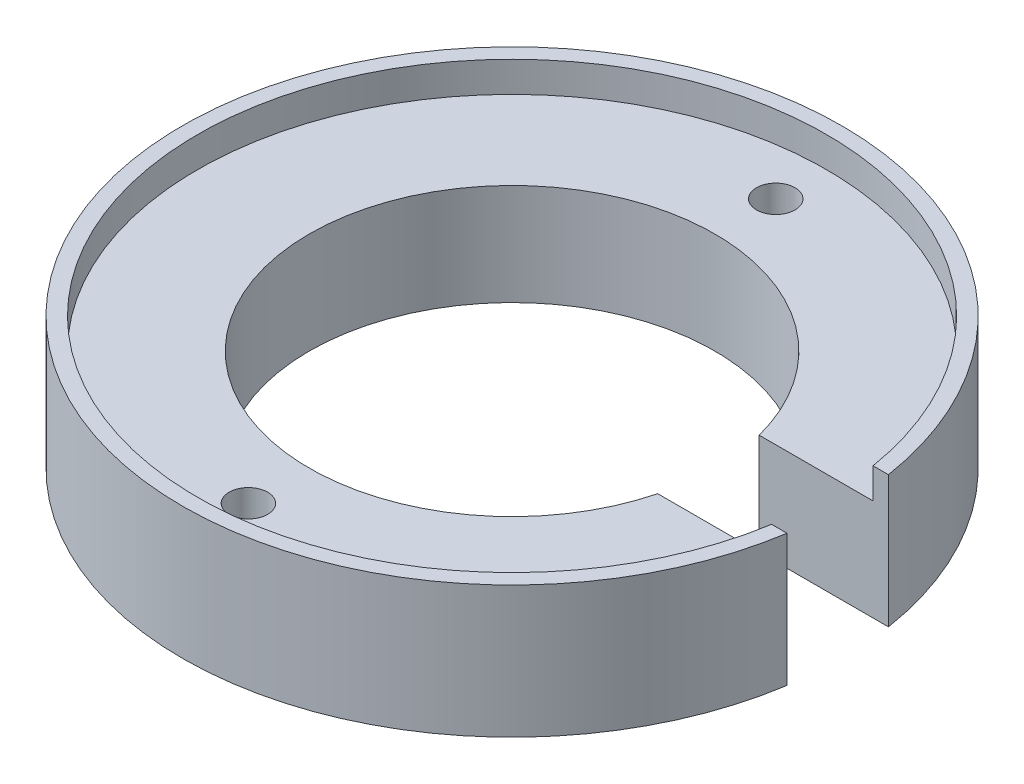
ISO-10303-21;
HEADER;
FILE_DESCRIPTION(('STEP AP214'),'2;1');
FILE_NAME('part.step','',(''),(''),'','','');
FILE_SCHEMA(('AUTOMOTIVE_DESIGN { 1 0 10303 214 1 1 1 1 }'));
ENDSEC;
DATA;
#1=APPLICATION_CONTEXT('core data for automotive mechanical design processes');
#2=APPLICATION_PROTOCOL_DEFINITION('international standard','automotive_design',2000,#1);
#3=PRODUCT_CONTEXT('',#1,'mechanical');
#4=PRODUCT('Part','Part','',(#3));
#5=PRODUCT_RELATED_PRODUCT_CATEGORY('part','',(#4));
#6=PRODUCT_DEFINITION_FORMATION('','',#4);
#7=PRODUCT_DEFINITION_CONTEXT('part definition',#1,'design');
#8=PRODUCT_DEFINITION('design','',#6,#7);
#9=PRODUCT_DEFINITION_SHAPE('','',#8);
#10=(LENGTH_UNIT() NAMED_UNIT(*) SI_UNIT(.MILLI.,.METRE.));
#11=(NAMED_UNIT(*) PLANE_ANGLE_UNIT() SI_UNIT($,.RADIAN.));
#12=(NAMED_UNIT(*) SI_UNIT($,.STERADIAN.) SOLID_ANGLE_UNIT());
#13=UNCERTAINTY_MEASURE_WITH_UNIT(LENGTH_MEASURE(1.E-05),#10,'distance_accuracy_value','');
#14=(GEOMETRIC_REPRESENTATION_CONTEXT(3) GLOBAL_UNCERTAINTY_ASSIGNED_CONTEXT((#13)) GLOBAL_UNIT_ASSIGNED_CONTEXT((#10,
#11,#12)) REPRESENTATION_CONTEXT('',''));
#15=CARTESIAN_POINT('',(0.,0.,0.));
#16=DIRECTION('',(0.,0.,1.));
#17=DIRECTION('',(1.,0.,0.));
#18=AXIS2_PLACEMENT_3D('',#15,#16,#17);
#19=CARTESIAN_POINT('',(0.,10.,0.));
#20=DIRECTION('',(0.,-1.,0.));
#21=DIRECTION('',(0.,0.,-1.));
#22=AXIS2_PLACEMENT_3D('',#19,#20,#21);
#23=CYLINDRICAL_SURFACE('',#22,32.5);
#24=DIRECTION('',(0.,-1.,0.));
#25=VECTOR('',#24,1.);
#26=CARTESIAN_POINT('',(32.1130814466628,10.,-5.));
#27=LINE('',#26,#25);
#28=CARTESIAN_POINT('',(32.1130814466628,0.,-5.));
#29=VERTEX_POINT('',#28);
#30=CARTESIAN_POINT('',(32.1130814466628,13.,-5.));
#31=VERTEX_POINT('',#30);
#32=EDGE_CURVE('E111',#29,#31,#27,.F.);
#33=ORIENTED_EDGE('',*,*,#32,.F.);
#34=CARTESIAN_POINT('',(0.,0.,0.));
#35=DIRECTION('',(0.,1.,0.));
#36=DIRECTION('',(0.,0.,1.));
#37=AXIS2_PLACEMENT_3D('',#34,#35,#36);
#38=CIRCLE('',#37,32.5);
#39=CARTESIAN_POINT('',(32.1130814466628,0.,5.));
#40=VERTEX_POINT('',#39);
#41=EDGE_CURVE('E102',#29,#40,#38,.T.);
#42=ORIENTED_EDGE('',*,*,#41,.T.);
#43=DIRECTION('',(0.,-1.,0.));
#44=VECTOR('',#43,1.);
#45=CARTESIAN_POINT('',(32.1130814466628,10.,5.));
#46=LINE('',#45,#44);
#47=CARTESIAN_POINT('',(32.1130814466628,13.,5.));
#48=VERTEX_POINT('',#47);
#49=EDGE_CURVE('E114',#48,#40,#46,.T.);
#50=ORIENTED_EDGE('',*,*,#49,.F.);
#51=CARTESIAN_POINT('',(0.,13.,0.));
#52=DIRECTION('',(0.,1.,0.));
#53=DIRECTION('',(0.,0.,1.));
#54=AXIS2_PLACEMENT_3D('',#51,#52,#53);
#55=CIRCLE('',#54,32.5);
#56=EDGE_CURVE('E105',#31,#48,#55,.T.);
#57=ORIENTED_EDGE('',*,*,#56,.F.);
#58=EDGE_LOOP('',(#33,#42,#50,#57));
#59=FACE_BOUND('',#58,.T.);
#60=ADVANCED_FACE('F32',(#59),#23,.T.);
#61=CARTESIAN_POINT('',(0.,0.,0.));
#62=DIRECTION('',(0.,1.,0.));
#63=DIRECTION('',(0.,0.,1.));
#64=AXIS2_PLACEMENT_3D('',#61,#62,#63);
#65=PLANE('',#64);
#66=CARTESIAN_POINT('',(0.,0.,-26.));
#67=DIRECTION('',(0.,1.,0.));
#68=DIRECTION('',(0.,0.,1.));
#69=AXIS2_PLACEMENT_3D('',#66,#67,#68);
#70=CIRCLE('',#69,1.9);
#71=CARTESIAN_POINT('',(0.,0.,-24.1));
#72=VERTEX_POINT('',#71);
#73=EDGE_CURVE('E134',#72,#72,#70,.T.);
#74=ORIENTED_EDGE('',*,*,#73,.T.);
#75=EDGE_LOOP('',(#74));
#76=FACE_BOUND('',#75,.T.);
#77=CARTESIAN_POINT('',(0.,0.,26.));
#78=DIRECTION('',(0.,1.,0.));
#79=DIRECTION('',(0.,0.,1.));
#80=AXIS2_PLACEMENT_3D('',#77,#78,#79);
#81=CIRCLE('',#80,1.9);
#82=CARTESIAN_POINT('',(0.,0.,27.9));
#83=VERTEX_POINT('',#82);
#84=EDGE_CURVE('E128',#83,#83,#81,.T.);
#85=ORIENTED_EDGE('',*,*,#84,.T.);
#86=EDGE_LOOP('',(#85));
#87=FACE_BOUND('',#86,.T.);
#88=DIRECTION('',(-1.,0.,0.));
#89=VECTOR('',#88,1.);
#90=CARTESIAN_POINT('',(0.,0.,-5.));
#91=LINE('',#90,#89);
#92=CARTESIAN_POINT('',(19.3649167310371,0.,-5.));
#93=VERTEX_POINT('',#92);
#94=EDGE_CURVE('E126',#29,#93,#91,.T.);
#95=ORIENTED_EDGE('',*,*,#94,.T.);
#96=CARTESIAN_POINT('',(0.,0.,0.));
#97=DIRECTION('',(0.,1.,0.));
#98=DIRECTION('',(0.,0.,1.));
#99=AXIS2_PLACEMENT_3D('',#96,#97,#98);
#100=CIRCLE('',#99,20.);
#101=CARTESIAN_POINT('',(19.3649167310371,0.,5.));
#102=VERTEX_POINT('',#101);
#103=EDGE_CURVE('E84',#93,#102,#100,.T.);
#104=ORIENTED_EDGE('',*,*,#103,.T.);
#105=DIRECTION('',(1.,0.,0.));
#106=VECTOR('',#105,1.);
#107=CARTESIAN_POINT('',(0.,0.,5.));
#108=LINE('',#107,#106);
#109=EDGE_CURVE('E124',#102,#40,#108,.T.);
#110=ORIENTED_EDGE('',*,*,#109,.T.);
#111=ORIENTED_EDGE('',*,*,#41,.F.);
#112=EDGE_LOOP('',(#95,#104,#110,#111));
#113=FACE_BOUND('',#112,.T.);
#114=ADVANCED_FACE('F141',(#76,#87,#113),#65,.F.);
#115=CARTESIAN_POINT('',(0.,13.,0.));
#116=DIRECTION('',(0.,1.,0.));
#117=DIRECTION('',(0.,0.,1.));
#118=AXIS2_PLACEMENT_3D('',#115,#116,#117);
#119=PLANE('',#118);
#120=CARTESIAN_POINT('',(0.,13.,0.));
#121=DIRECTION('',(0.,1.,0.));
#122=DIRECTION('',(0.,0.,1.));
#123=AXIS2_PLACEMENT_3D('',#120,#121,#122);
#124=CIRCLE('',#123,31.);
#125=CARTESIAN_POINT('',(30.5941170815567,13.,-5.));
#126=VERTEX_POINT('',#125);
#127=CARTESIAN_POINT('',(30.5941170815567,13.,5.));
#128=VERTEX_POINT('',#127);
#129=EDGE_CURVE('E108',#126,#128,#124,.T.);
#130=ORIENTED_EDGE('',*,*,#129,.F.);
#131=DIRECTION('',(-1.,0.,0.));
#132=VECTOR('',#131,1.);
#133=CARTESIAN_POINT('',(0.,13.,-5.));
#134=LINE('',#133,#132);
#135=EDGE_CURVE('E122',#31,#126,#134,.T.);
#136=ORIENTED_EDGE('',*,*,#135,.F.);
#137=ORIENTED_EDGE('',*,*,#56,.T.);
#138=DIRECTION('',(1.,0.,0.));
#139=VECTOR('',#138,1.);
#140=CARTESIAN_POINT('',(0.,13.,5.));
#141=LINE('',#140,#139);
#142=EDGE_CURVE('E120',#128,#48,#141,.T.);
#143=ORIENTED_EDGE('',*,*,#142,.F.);
#144=EDGE_LOOP('',(#130,#136,#137,#143));
#145=FACE_BOUND('',#144,.T.);
#146=ADVANCED_FACE('F153',(#145),#119,.T.);
#147=CARTESIAN_POINT('',(0.,13.,0.));
#148=DIRECTION('',(0.,-1.,0.));
#149=DIRECTION('',(0.,0.,-1.));
#150=AXIS2_PLACEMENT_3D('',#147,#148,#149);
#151=CYLINDRICAL_SURFACE('',#150,31.);
#152=CARTESIAN_POINT('',(0.,10.,0.));
#153=DIRECTION('',(0.,1.,0.));
#154=DIRECTION('',(0.,0.,1.));
#155=AXIS2_PLACEMENT_3D('',#152,#153,#154);
#156=CIRCLE('',#155,31.);
#157=CARTESIAN_POINT('',(30.5941170815567,10.,5.));
#158=VERTEX_POINT('',#157);
#159=CARTESIAN_POINT('',(30.5941170815567,10.,-5.));
#160=VERTEX_POINT('',#159);
#161=EDGE_CURVE('E98',#158,#160,#156,.F.);
#162=ORIENTED_EDGE('',*,*,#161,.T.);
#163=DIRECTION('',(0.,-1.,0.));
#164=VECTOR('',#163,1.);
#165=CARTESIAN_POINT('',(30.5941170815567,13.,-5.));
#166=LINE('',#165,#164);
#167=EDGE_CURVE('E96',#160,#126,#166,.F.);
#168=ORIENTED_EDGE('',*,*,#167,.T.);
#169=ORIENTED_EDGE('',*,*,#129,.T.);
#170=DIRECTION('',(0.,-1.,0.));
#171=VECTOR('',#170,1.);
#172=CARTESIAN_POINT('',(30.5941170815567,13.,5.));
#173=LINE('',#172,#171);
#174=EDGE_CURVE('E117',#128,#158,#173,.T.);
#175=ORIENTED_EDGE('',*,*,#174,.T.);
#176=EDGE_LOOP('',(#162,#168,#169,#175));
#177=FACE_BOUND('',#176,.T.);
#178=ADVANCED_FACE('F155',(#177),#151,.F.);
#179=CARTESIAN_POINT('',(0.,10.,0.));
#180=DIRECTION('',(0.,1.,0.));
#181=DIRECTION('',(0.,0.,1.));
#182=AXIS2_PLACEMENT_3D('',#179,#180,#181);
#183=PLANE('',#182);
#184=CARTESIAN_POINT('',(0.,10.,0.));
#185=DIRECTION('',(0.,1.,0.));
#186=DIRECTION('',(0.,0.,1.));
#187=AXIS2_PLACEMENT_3D('',#184,#185,#186);
#188=CIRCLE('',#187,20.);
#189=CARTESIAN_POINT('',(19.3649167310371,10.,-5.));
#190=VERTEX_POINT('',#189);
#191=CARTESIAN_POINT('',(19.3649167310371,10.,5.));
#192=VERTEX_POINT('',#191);
#193=EDGE_CURVE('E45',#190,#192,#188,.T.);
#194=ORIENTED_EDGE('',*,*,#193,.F.);
#195=DIRECTION('',(1.,0.,0.));
#196=VECTOR('',#195,1.);
#197=CARTESIAN_POINT('',(0.,10.,-5.));
#198=LINE('',#197,#196);
#199=EDGE_CURVE('E39',#190,#160,#198,.T.);
#200=ORIENTED_EDGE('',*,*,#199,.T.);
#201=ORIENTED_EDGE('',*,*,#161,.F.);
#202=DIRECTION('',(-1.,0.,0.));
#203=VECTOR('',#202,1.);
#204=CARTESIAN_POINT('',(0.,10.,5.));
#205=LINE('',#204,#203);
#206=EDGE_CURVE('E92',#158,#192,#205,.T.);
#207=ORIENTED_EDGE('',*,*,#206,.T.);
#208=EDGE_LOOP('',(#194,#200,#201,#207));
#209=FACE_BOUND('',#208,.T.);
#210=CARTESIAN_POINT('',(0.,10.,-26.));
#211=DIRECTION('',(0.,1.,0.));
#212=DIRECTION('',(0.,0.,1.));
#213=AXIS2_PLACEMENT_3D('',#210,#211,#212);
#214=CIRCLE('',#213,1.9);
#215=CARTESIAN_POINT('',(0.,10.,-24.1));
#216=VERTEX_POINT('',#215);
#217=EDGE_CURVE('E87',#216,#216,#214,.T.);
#218=ORIENTED_EDGE('',*,*,#217,.F.);
#219=EDGE_LOOP('',(#218));
#220=FACE_BOUND('',#219,.T.);
#221=CARTESIAN_POINT('',(0.,10.,26.));
#222=DIRECTION('',(0.,1.,0.));
#223=DIRECTION('',(0.,0.,1.));
#224=AXIS2_PLACEMENT_3D('',#221,#222,#223);
#225=CIRCLE('',#224,1.9);
#226=CARTESIAN_POINT('',(0.,10.,27.9));
#227=VERTEX_POINT('',#226);
#228=EDGE_CURVE('E131',#227,#227,#225,.T.);
#229=ORIENTED_EDGE('',*,*,#228,.F.);
#230=EDGE_LOOP('',(#229));
#231=FACE_BOUND('',#230,.T.);
#232=ADVANCED_FACE('F90',(#209,#220,#231),#183,.T.);
#233=CARTESIAN_POINT('',(0.,13.,-5.));
#234=DIRECTION('',(0.,0.,1.));
#235=DIRECTION('',(1.,0.,0.));
#236=AXIS2_PLACEMENT_3D('',#233,#234,#235);
#237=PLANE('',#236);
#238=DIRECTION('',(0.,1.,0.));
#239=VECTOR('',#238,1.);
#240=CARTESIAN_POINT('',(19.3649167310371,0.,-5.));
#241=LINE('',#240,#239);
#242=EDGE_CURVE('E81',#93,#190,#241,.T.);
#243=ORIENTED_EDGE('',*,*,#242,.F.);
#244=ORIENTED_EDGE('',*,*,#94,.F.);
#245=ORIENTED_EDGE('',*,*,#32,.T.);
#246=ORIENTED_EDGE('',*,*,#135,.T.);
#247=ORIENTED_EDGE('',*,*,#167,.F.);
#248=ORIENTED_EDGE('',*,*,#199,.F.);
#249=EDGE_LOOP('',(#243,#244,#245,#246,#247,#248));
#250=FACE_BOUND('',#249,.T.);
#251=ADVANCED_FACE('F94',(#250),#237,.T.);
#252=CARTESIAN_POINT('',(0.,13.,5.));
#253=DIRECTION('',(0.,0.,-1.));
#254=DIRECTION('',(-1.,0.,0.));
#255=AXIS2_PLACEMENT_3D('',#252,#253,#254);
#256=PLANE('',#255);
#257=DIRECTION('',(0.,1.,0.));
#258=VECTOR('',#257,1.);
#259=CARTESIAN_POINT('',(19.3649167310371,0.,5.));
#260=LINE('',#259,#258);
#261=EDGE_CURVE('E11',#192,#102,#260,.F.);
#262=ORIENTED_EDGE('',*,*,#261,.F.);
#263=ORIENTED_EDGE('',*,*,#206,.F.);
#264=ORIENTED_EDGE('',*,*,#174,.F.);
#265=ORIENTED_EDGE('',*,*,#142,.T.);
#266=ORIENTED_EDGE('',*,*,#49,.T.);
#267=ORIENTED_EDGE('',*,*,#109,.F.);
#268=EDGE_LOOP('',(#262,#263,#264,#265,#266,#267));
#269=FACE_BOUND('',#268,.T.);
#270=ADVANCED_FACE('F144',(#269),#256,.T.);
#271=CARTESIAN_POINT('',(0.,10.,26.));
#272=DIRECTION('',(0.,1.,0.));
#273=DIRECTION('',(0.,0.,1.));
#274=AXIS2_PLACEMENT_3D('',#271,#272,#273);
#275=CYLINDRICAL_SURFACE('',#274,1.9);
#276=ORIENTED_EDGE('',*,*,#84,.F.);
#277=EDGE_LOOP('',(#276));
#278=FACE_BOUND('',#277,.T.);
#279=ORIENTED_EDGE('',*,*,#228,.T.);
#280=EDGE_LOOP('',(#279));
#281=FACE_BOUND('',#280,.T.);
#282=ADVANCED_FACE('F176',(#278,#281),#275,.F.);
#283=CARTESIAN_POINT('',(0.,10.,-26.));
#284=DIRECTION('',(0.,1.,0.));
#285=DIRECTION('',(0.,0.,1.));
#286=AXIS2_PLACEMENT_3D('',#283,#284,#285);
#287=CYLINDRICAL_SURFACE('',#286,1.9);
#288=ORIENTED_EDGE('',*,*,#73,.F.);
#289=EDGE_LOOP('',(#288));
#290=FACE_BOUND('',#289,.T.);
#291=ORIENTED_EDGE('',*,*,#217,.T.);
#292=EDGE_LOOP('',(#291));
#293=FACE_BOUND('',#292,.T.);
#294=ADVANCED_FACE('F179',(#290,#293),#287,.F.);
#295=CARTESIAN_POINT('',(0.,0.,0.));
#296=DIRECTION('',(0.,1.,0.));
#297=DIRECTION('',(0.,0.,1.));
#298=AXIS2_PLACEMENT_3D('',#295,#296,#297);
#299=CYLINDRICAL_SURFACE('',#298,20.);
#300=ORIENTED_EDGE('',*,*,#242,.T.);
#301=ORIENTED_EDGE('',*,*,#193,.T.);
#302=ORIENTED_EDGE('',*,*,#261,.T.);
#303=ORIENTED_EDGE('',*,*,#103,.F.);
#304=EDGE_LOOP('',(#300,#301,#302,#303));
#305=FACE_BOUND('',#304,.T.);
#306=ADVANCED_FACE('F82',(#305),#299,.F.);
#307=CLOSED_SHELL('',(#60,#114,#146,#178,#232,#251,#270,#282,#294,#306));
#308=MANIFOLD_SOLID_BREP('B2',#307);
#309=ADVANCED_BREP_SHAPE_REPRESENTATION('',(#18,#308),#14);
#310=SHAPE_DEFINITION_REPRESENTATION(#9,#309);
ENDSEC;
END-ISO-10303-21;
